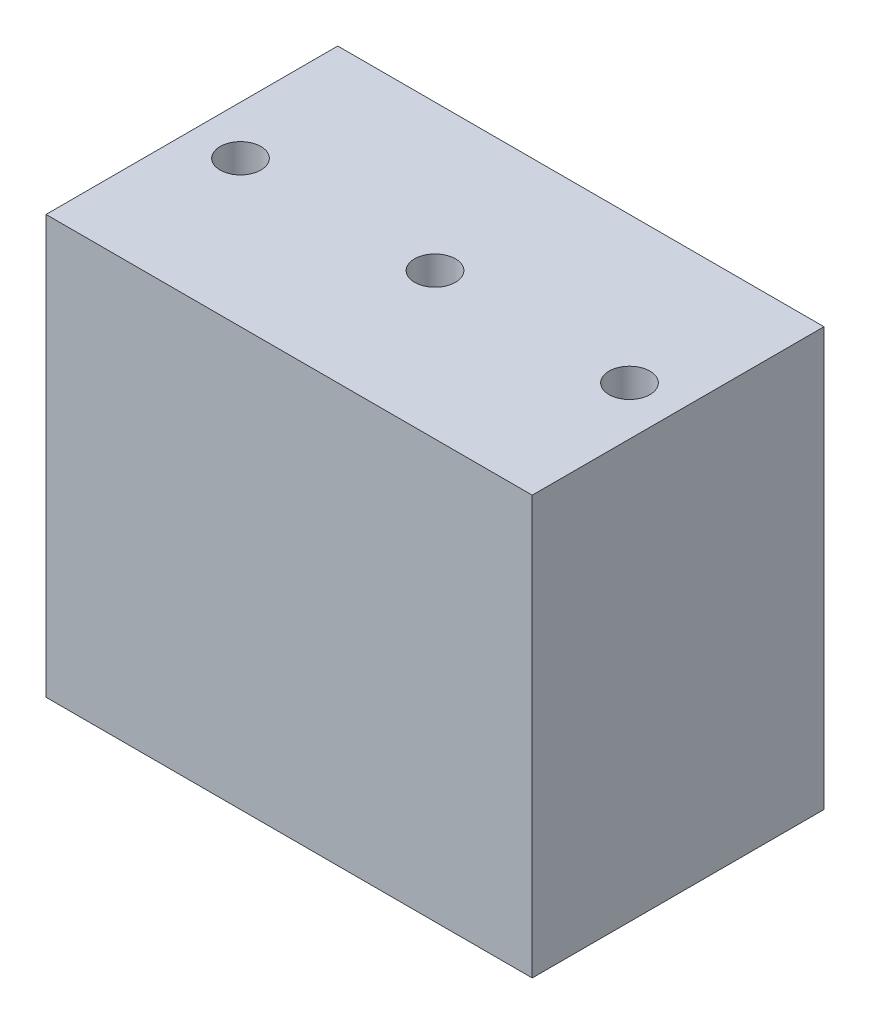
ISO-10303-21;
HEADER;
FILE_DESCRIPTION(('STEP AP214'),'2;1');
FILE_NAME('part.step','',(''),(''),'','','');
FILE_SCHEMA(('AUTOMOTIVE_DESIGN { 1 0 10303 214 1 1 1 1 }'));
ENDSEC;
DATA;
#1=APPLICATION_CONTEXT('core data for automotive mechanical design processes');
#2=APPLICATION_PROTOCOL_DEFINITION('international standard','automotive_design',2000,#1);
#3=PRODUCT_CONTEXT('',#1,'mechanical');
#4=PRODUCT('Part','Part','',(#3));
#5=PRODUCT_RELATED_PRODUCT_CATEGORY('part','',(#4));
#6=PRODUCT_DEFINITION_FORMATION('','',#4);
#7=PRODUCT_DEFINITION_CONTEXT('part definition',#1,'design');
#8=PRODUCT_DEFINITION('design','',#6,#7);
#9=PRODUCT_DEFINITION_SHAPE('','',#8);
#10=(LENGTH_UNIT() NAMED_UNIT(*) SI_UNIT(.MILLI.,.METRE.));
#11=(NAMED_UNIT(*) PLANE_ANGLE_UNIT() SI_UNIT($,.RADIAN.));
#12=(NAMED_UNIT(*) SI_UNIT($,.STERADIAN.) SOLID_ANGLE_UNIT());
#13=UNCERTAINTY_MEASURE_WITH_UNIT(LENGTH_MEASURE(1.E-05),#10,'distance_accuracy_value','');
#14=(GEOMETRIC_REPRESENTATION_CONTEXT(3) GLOBAL_UNCERTAINTY_ASSIGNED_CONTEXT((#13)) GLOBAL_UNIT_ASSIGNED_CONTEXT((#10,
#11,#12)) REPRESENTATION_CONTEXT('',''));
#15=CARTESIAN_POINT('',(0.,0.,0.));
#16=DIRECTION('',(0.,0.,1.));
#17=DIRECTION('',(1.,0.,0.));
#18=AXIS2_PLACEMENT_3D('',#15,#16,#17);
#19=CARTESIAN_POINT('',(0.,43.,0.));
#20=DIRECTION('',(0.,1.,0.));
#21=DIRECTION('',(0.,0.,1.));
#22=AXIS2_PLACEMENT_3D('',#19,#20,#21);
#23=PLANE('',#22);
#24=CARTESIAN_POINT('',(0.,43.,0.));
#25=DIRECTION('',(0.,1.,0.));
#26=DIRECTION('',(0.,0.,1.));
#27=AXIS2_PLACEMENT_3D('',#24,#25,#26);
#28=CIRCLE('',#27,2.1);
#29=CARTESIAN_POINT('',(0.,43.,2.1));
#30=VERTEX_POINT('',#29);
#31=EDGE_CURVE('E115',#30,#30,#28,.T.);
#32=ORIENTED_EDGE('',*,*,#31,.F.);
#33=EDGE_LOOP('',(#32));
#34=FACE_BOUND('',#33,.T.);
#35=DIRECTION('',(0.,0.,-1.));
#36=VECTOR('',#35,1.);
#37=CARTESIAN_POINT('',(25.,43.,-15.));
#38=LINE('',#37,#36);
#39=CARTESIAN_POINT('',(25.,43.,15.));
#40=VERTEX_POINT('',#39);
#41=CARTESIAN_POINT('',(25.,43.,-15.));
#42=VERTEX_POINT('',#41);
#43=EDGE_CURVE('E85',#40,#42,#38,.T.);
#44=ORIENTED_EDGE('',*,*,#43,.T.);
#45=DIRECTION('',(-1.,0.,0.));
#46=VECTOR('',#45,1.);
#47=CARTESIAN_POINT('',(-25.,43.,-15.));
#48=LINE('',#47,#46);
#49=CARTESIAN_POINT('',(-25.,43.,-15.));
#50=VERTEX_POINT('',#49);
#51=EDGE_CURVE('E80',#42,#50,#48,.T.);
#52=ORIENTED_EDGE('',*,*,#51,.T.);
#53=DIRECTION('',(0.,0.,1.));
#54=VECTOR('',#53,1.);
#55=CARTESIAN_POINT('',(-25.,43.,-15.));
#56=LINE('',#55,#54);
#57=CARTESIAN_POINT('',(-25.,43.,15.));
#58=VERTEX_POINT('',#57);
#59=EDGE_CURVE('E83',#50,#58,#56,.T.);
#60=ORIENTED_EDGE('',*,*,#59,.T.);
#61=DIRECTION('',(1.,0.,0.));
#62=VECTOR('',#61,1.);
#63=CARTESIAN_POINT('',(-25.,43.,15.));
#64=LINE('',#63,#62);
#65=EDGE_CURVE('E50',#58,#40,#64,.T.);
#66=ORIENTED_EDGE('',*,*,#65,.T.);
#67=EDGE_LOOP('',(#44,#52,#60,#66));
#68=FACE_BOUND('',#67,.T.);
#69=CARTESIAN_POINT('',(-20.,43.,0.));
#70=DIRECTION('',(0.,1.,0.));
#71=DIRECTION('',(0.,0.,1.));
#72=AXIS2_PLACEMENT_3D('',#69,#70,#71);
#73=CIRCLE('',#72,2.1);
#74=CARTESIAN_POINT('',(-20.,43.,2.1));
#75=VERTEX_POINT('',#74);
#76=EDGE_CURVE('E100',#75,#75,#73,.T.);
#77=ORIENTED_EDGE('',*,*,#76,.F.);
#78=EDGE_LOOP('',(#77));
#79=FACE_BOUND('',#78,.T.);
#80=CARTESIAN_POINT('',(20.,43.,0.));
#81=DIRECTION('',(0.,1.,0.));
#82=DIRECTION('',(0.,0.,1.));
#83=AXIS2_PLACEMENT_3D('',#80,#81,#82);
#84=CIRCLE('',#83,2.1);
#85=CARTESIAN_POINT('',(20.,43.,2.1));
#86=VERTEX_POINT('',#85);
#87=EDGE_CURVE('E121',#86,#86,#84,.T.);
#88=ORIENTED_EDGE('',*,*,#87,.F.);
#89=EDGE_LOOP('',(#88));
#90=FACE_BOUND('',#89,.T.);
#91=ADVANCED_FACE('F33',(#34,#68,#79,#90),#23,.T.);
#92=CARTESIAN_POINT('',(0.,0.,0.));
#93=DIRECTION('',(0.,1.,0.));
#94=DIRECTION('',(0.,0.,1.));
#95=AXIS2_PLACEMENT_3D('',#92,#93,#94);
#96=PLANE('',#95);
#97=DIRECTION('',(0.,0.,-1.));
#98=VECTOR('',#97,1.);
#99=CARTESIAN_POINT('',(25.,0.,-15.));
#100=LINE('',#99,#98);
#101=CARTESIAN_POINT('',(25.,0.,15.));
#102=VERTEX_POINT('',#101);
#103=CARTESIAN_POINT('',(25.,0.,-15.));
#104=VERTEX_POINT('',#103);
#105=EDGE_CURVE('E97',#102,#104,#100,.T.);
#106=ORIENTED_EDGE('',*,*,#105,.F.);
#107=DIRECTION('',(1.,0.,0.));
#108=VECTOR('',#107,1.);
#109=CARTESIAN_POINT('',(-25.,0.,15.));
#110=LINE('',#109,#108);
#111=CARTESIAN_POINT('',(-25.,0.,15.));
#112=VERTEX_POINT('',#111);
#113=EDGE_CURVE('E73',#112,#102,#110,.T.);
#114=ORIENTED_EDGE('',*,*,#113,.F.);
#115=DIRECTION('',(0.,0.,1.));
#116=VECTOR('',#115,1.);
#117=CARTESIAN_POINT('',(-25.,0.,-15.));
#118=LINE('',#117,#116);
#119=CARTESIAN_POINT('',(-25.,0.,-15.));
#120=VERTEX_POINT('',#119);
#121=EDGE_CURVE('E67',#120,#112,#118,.T.);
#122=ORIENTED_EDGE('',*,*,#121,.F.);
#123=DIRECTION('',(-1.,0.,0.));
#124=VECTOR('',#123,1.);
#125=CARTESIAN_POINT('',(-25.,0.,-15.));
#126=LINE('',#125,#124);
#127=EDGE_CURVE('E89',#104,#120,#126,.T.);
#128=ORIENTED_EDGE('',*,*,#127,.F.);
#129=EDGE_LOOP('',(#106,#114,#122,#128));
#130=FACE_BOUND('',#129,.T.);
#131=CARTESIAN_POINT('',(-20.,0.,0.));
#132=DIRECTION('',(0.,1.,0.));
#133=DIRECTION('',(0.,0.,1.));
#134=AXIS2_PLACEMENT_3D('',#131,#132,#133);
#135=CIRCLE('',#134,2.1);
#136=CARTESIAN_POINT('',(-20.,0.,2.1));
#137=VERTEX_POINT('',#136);
#138=EDGE_CURVE('E112',#137,#137,#135,.T.);
#139=ORIENTED_EDGE('',*,*,#138,.T.);
#140=EDGE_LOOP('',(#139));
#141=FACE_BOUND('',#140,.T.);
#142=CARTESIAN_POINT('',(0.,0.,0.));
#143=DIRECTION('',(0.,1.,0.));
#144=DIRECTION('',(0.,0.,1.));
#145=AXIS2_PLACEMENT_3D('',#142,#143,#144);
#146=CIRCLE('',#145,2.1);
#147=CARTESIAN_POINT('',(0.,0.,2.1));
#148=VERTEX_POINT('',#147);
#149=EDGE_CURVE('E118',#148,#148,#146,.T.);
#150=ORIENTED_EDGE('',*,*,#149,.T.);
#151=EDGE_LOOP('',(#150));
#152=FACE_BOUND('',#151,.T.);
#153=CARTESIAN_POINT('',(20.,0.,0.));
#154=DIRECTION('',(0.,1.,0.));
#155=DIRECTION('',(0.,0.,1.));
#156=AXIS2_PLACEMENT_3D('',#153,#154,#155);
#157=CIRCLE('',#156,2.1);
#158=CARTESIAN_POINT('',(20.,0.,2.1));
#159=VERTEX_POINT('',#158);
#160=EDGE_CURVE('E124',#159,#159,#157,.T.);
#161=ORIENTED_EDGE('',*,*,#160,.T.);
#162=EDGE_LOOP('',(#161));
#163=FACE_BOUND('',#162,.T.);
#164=ADVANCED_FACE('F108',(#130,#141,#152,#163),#96,.F.);
#165=CARTESIAN_POINT('',(25.,43.,-15.));
#166=DIRECTION('',(-1.,0.,0.));
#167=DIRECTION('',(0.,0.,1.));
#168=AXIS2_PLACEMENT_3D('',#165,#166,#167);
#169=PLANE('',#168);
#170=ORIENTED_EDGE('',*,*,#105,.T.);
#171=DIRECTION('',(0.,-1.,0.));
#172=VECTOR('',#171,1.);
#173=CARTESIAN_POINT('',(25.,43.,-15.));
#174=LINE('',#173,#172);
#175=EDGE_CURVE('E11',#42,#104,#174,.T.);
#176=ORIENTED_EDGE('',*,*,#175,.F.);
#177=ORIENTED_EDGE('',*,*,#43,.F.);
#178=DIRECTION('',(0.,-1.,0.));
#179=VECTOR('',#178,1.);
#180=CARTESIAN_POINT('',(25.,43.,15.));
#181=LINE('',#180,#179);
#182=EDGE_CURVE('E93',#40,#102,#181,.T.);
#183=ORIENTED_EDGE('',*,*,#182,.T.);
#184=EDGE_LOOP('',(#170,#176,#177,#183));
#185=FACE_BOUND('',#184,.T.);
#186=ADVANCED_FACE('F35',(#185),#169,.F.);
#187=CARTESIAN_POINT('',(-25.,43.,-15.));
#188=DIRECTION('',(0.,0.,1.));
#189=DIRECTION('',(1.,0.,0.));
#190=AXIS2_PLACEMENT_3D('',#187,#188,#189);
#191=PLANE('',#190);
#192=ORIENTED_EDGE('',*,*,#127,.T.);
#193=DIRECTION('',(0.,-1.,0.));
#194=VECTOR('',#193,1.);
#195=CARTESIAN_POINT('',(-25.,43.,-15.));
#196=LINE('',#195,#194);
#197=EDGE_CURVE('E42',#50,#120,#196,.T.);
#198=ORIENTED_EDGE('',*,*,#197,.F.);
#199=ORIENTED_EDGE('',*,*,#51,.F.);
#200=ORIENTED_EDGE('',*,*,#175,.T.);
#201=EDGE_LOOP('',(#192,#198,#199,#200));
#202=FACE_BOUND('',#201,.T.);
#203=ADVANCED_FACE('F88',(#202),#191,.F.);
#204=CARTESIAN_POINT('',(-25.,43.,-15.));
#205=DIRECTION('',(1.,0.,0.));
#206=DIRECTION('',(0.,0.,-1.));
#207=AXIS2_PLACEMENT_3D('',#204,#205,#206);
#208=PLANE('',#207);
#209=ORIENTED_EDGE('',*,*,#121,.T.);
#210=DIRECTION('',(0.,-1.,0.));
#211=VECTOR('',#210,1.);
#212=CARTESIAN_POINT('',(-25.,43.,15.));
#213=LINE('',#212,#211);
#214=EDGE_CURVE('E90',#58,#112,#213,.T.);
#215=ORIENTED_EDGE('',*,*,#214,.F.);
#216=ORIENTED_EDGE('',*,*,#59,.F.);
#217=ORIENTED_EDGE('',*,*,#197,.T.);
#218=EDGE_LOOP('',(#209,#215,#216,#217));
#219=FACE_BOUND('',#218,.T.);
#220=ADVANCED_FACE('F91',(#219),#208,.F.);
#221=CARTESIAN_POINT('',(-25.,43.,15.));
#222=DIRECTION('',(0.,0.,-1.));
#223=DIRECTION('',(-1.,0.,0.));
#224=AXIS2_PLACEMENT_3D('',#221,#222,#223);
#225=PLANE('',#224);
#226=ORIENTED_EDGE('',*,*,#113,.T.);
#227=ORIENTED_EDGE('',*,*,#182,.F.);
#228=ORIENTED_EDGE('',*,*,#65,.F.);
#229=ORIENTED_EDGE('',*,*,#214,.T.);
#230=EDGE_LOOP('',(#226,#227,#228,#229));
#231=FACE_BOUND('',#230,.T.);
#232=ADVANCED_FACE('F105',(#231),#225,.F.);
#233=CARTESIAN_POINT('',(-20.,43.,0.));
#234=DIRECTION('',(0.,-1.,0.));
#235=DIRECTION('',(0.,0.,-1.));
#236=AXIS2_PLACEMENT_3D('',#233,#234,#235);
#237=CYLINDRICAL_SURFACE('',#236,2.1);
#238=ORIENTED_EDGE('',*,*,#76,.T.);
#239=EDGE_LOOP('',(#238));
#240=FACE_BOUND('',#239,.T.);
#241=ORIENTED_EDGE('',*,*,#138,.F.);
#242=EDGE_LOOP('',(#241));
#243=FACE_BOUND('',#242,.T.);
#244=ADVANCED_FACE('F142',(#240,#243),#237,.F.);
#245=CARTESIAN_POINT('',(0.,43.,0.));
#246=DIRECTION('',(0.,-1.,0.));
#247=DIRECTION('',(0.,0.,-1.));
#248=AXIS2_PLACEMENT_3D('',#245,#246,#247);
#249=CYLINDRICAL_SURFACE('',#248,2.1);
#250=ORIENTED_EDGE('',*,*,#31,.T.);
#251=EDGE_LOOP('',(#250));
#252=FACE_BOUND('',#251,.T.);
#253=ORIENTED_EDGE('',*,*,#149,.F.);
#254=EDGE_LOOP('',(#253));
#255=FACE_BOUND('',#254,.T.);
#256=ADVANCED_FACE('F188',(#252,#255),#249,.F.);
#257=CARTESIAN_POINT('',(20.,43.,0.));
#258=DIRECTION('',(0.,-1.,0.));
#259=DIRECTION('',(0.,0.,-1.));
#260=AXIS2_PLACEMENT_3D('',#257,#258,#259);
#261=CYLINDRICAL_SURFACE('',#260,2.1);
#262=ORIENTED_EDGE('',*,*,#87,.T.);
#263=EDGE_LOOP('',(#262));
#264=FACE_BOUND('',#263,.T.);
#265=ORIENTED_EDGE('',*,*,#160,.F.);
#266=EDGE_LOOP('',(#265));
#267=FACE_BOUND('',#266,.T.);
#268=ADVANCED_FACE('F130',(#264,#267),#261,.F.);
#269=CLOSED_SHELL('',(#91,#164,#186,#203,#220,#232,#244,#256,#268));
#270=MANIFOLD_SOLID_BREP('B2',#269);
#271=ADVANCED_BREP_SHAPE_REPRESENTATION('',(#18,#270),#14);
#272=SHAPE_DEFINITION_REPRESENTATION(#9,#271);
ENDSEC;
END-ISO-10303-21;
